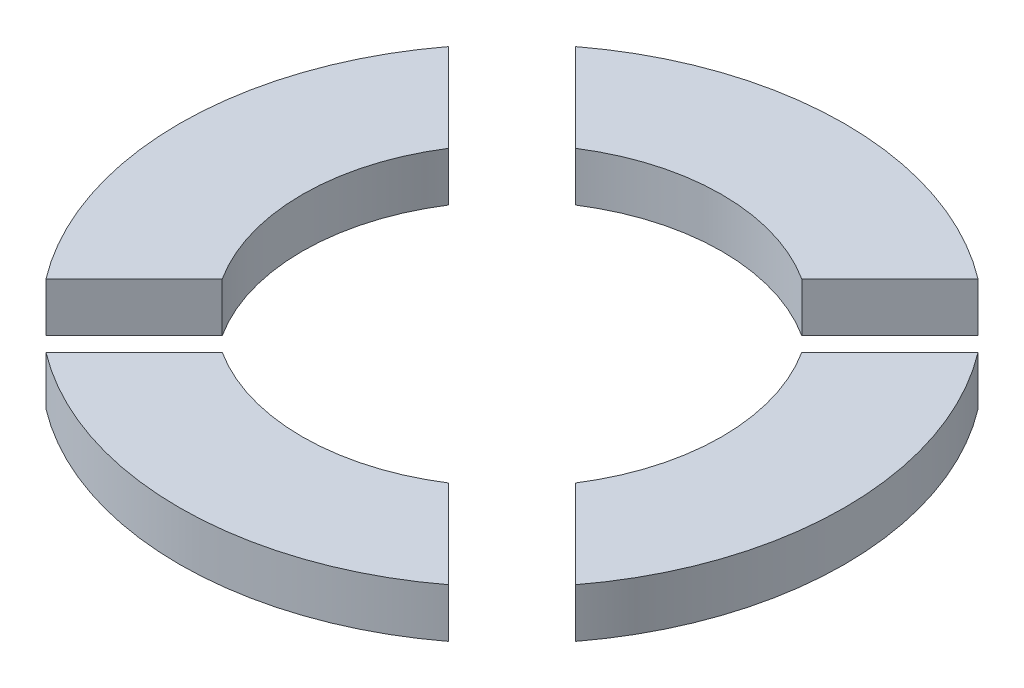
ISO-10303-21;
HEADER;
FILE_DESCRIPTION(('STEP AP214'),'2;1');
FILE_NAME('part.step','',(''),(''),'','','');
FILE_SCHEMA(('AUTOMOTIVE_DESIGN { 1 0 10303 214 1 1 1 1 }'));
ENDSEC;
DATA;
#1=APPLICATION_CONTEXT('core data for automotive mechanical design processes');
#2=APPLICATION_PROTOCOL_DEFINITION('international standard','automotive_design',2000,#1);
#3=PRODUCT_CONTEXT('',#1,'mechanical');
#4=PRODUCT('Part','Part','',(#3));
#5=PRODUCT_RELATED_PRODUCT_CATEGORY('part','',(#4));
#6=PRODUCT_DEFINITION_FORMATION('','',#4);
#7=PRODUCT_DEFINITION_CONTEXT('part definition',#1,'design');
#8=PRODUCT_DEFINITION('design','',#6,#7);
#9=PRODUCT_DEFINITION_SHAPE('','',#8);
#10=(LENGTH_UNIT() NAMED_UNIT(*) SI_UNIT(.MILLI.,.METRE.));
#11=(NAMED_UNIT(*) PLANE_ANGLE_UNIT() SI_UNIT($,.RADIAN.));
#12=(NAMED_UNIT(*) SI_UNIT($,.STERADIAN.) SOLID_ANGLE_UNIT());
#13=UNCERTAINTY_MEASURE_WITH_UNIT(LENGTH_MEASURE(1.E-05),#10,'distance_accuracy_value','');
#14=(GEOMETRIC_REPRESENTATION_CONTEXT(3) GLOBAL_UNCERTAINTY_ASSIGNED_CONTEXT((#13)) GLOBAL_UNIT_ASSIGNED_CONTEXT((#10,
#11,#12)) REPRESENTATION_CONTEXT('',''));
#15=CARTESIAN_POINT('',(0.,0.,0.));
#16=DIRECTION('',(0.,0.,1.));
#17=DIRECTION('',(1.,0.,0.));
#18=AXIS2_PLACEMENT_3D('',#15,#16,#17);
#19=CARTESIAN_POINT('',(0.,0.12,0.));
#20=DIRECTION('',(0.,-1.,0.));
#21=DIRECTION('',(0.,0.,-1.));
#22=AXIS2_PLACEMENT_3D('',#19,#20,#21);
#23=CYLINDRICAL_SURFACE('',#22,0.8125);
#24=CARTESIAN_POINT('',(0.,0.,0.));
#25=DIRECTION('',(0.,1.,0.));
#26=DIRECTION('',(0.,0.,1.));
#27=AXIS2_PLACEMENT_3D('',#24,#25,#26);
#28=CIRCLE('',#27,0.8125);
#29=CARTESIAN_POINT('',(-0.647016429518933,0.,-0.491452937657891));
#30=VERTEX_POINT('',#29);
#31=CARTESIAN_POINT('',(-0.647016429518933,0.,0.491452937657891));
#32=VERTEX_POINT('',#31);
#33=EDGE_CURVE('E113',#30,#32,#28,.T.);
#34=ORIENTED_EDGE('',*,*,#33,.T.);
#35=DIRECTION('',(0.,-1.,0.));
#36=VECTOR('',#35,1.);
#37=CARTESIAN_POINT('',(-0.647016429518933,0.12,0.491452937657891));
#38=LINE('',#37,#36);
#39=CARTESIAN_POINT('',(-0.647016429518933,0.12,0.491452937657891));
#40=VERTEX_POINT('',#39);
#41=EDGE_CURVE('E12',#40,#32,#38,.T.);
#42=ORIENTED_EDGE('',*,*,#41,.F.);
#43=CARTESIAN_POINT('',(0.,0.12,0.));
#44=DIRECTION('',(0.,1.,0.));
#45=DIRECTION('',(0.,0.,1.));
#46=AXIS2_PLACEMENT_3D('',#43,#44,#45);
#47=CIRCLE('',#46,0.8125);
#48=CARTESIAN_POINT('',(-0.647016429518933,0.12,-0.491452937657891));
#49=VERTEX_POINT('',#48);
#50=EDGE_CURVE('E101',#49,#40,#47,.T.);
#51=ORIENTED_EDGE('',*,*,#50,.F.);
#52=DIRECTION('',(0.,-1.,0.));
#53=VECTOR('',#52,1.);
#54=CARTESIAN_POINT('',(-0.647016429518933,0.12,-0.491452937657891));
#55=LINE('',#54,#53);
#56=EDGE_CURVE('E109',#49,#30,#55,.T.);
#57=ORIENTED_EDGE('',*,*,#56,.T.);
#58=EDGE_LOOP('',(#34,#42,#51,#57));
#59=FACE_BOUND('',#58,.T.);
#60=ADVANCED_FACE('F50',(#59),#23,.T.);
#61=CARTESIAN_POINT('',(-0.431728246125112,0.12,0.276164754264072));
#62=DIRECTION('',(-0.707106781186544,0.,-0.707106781186551));
#63=DIRECTION('',(-0.707106781186551,0.,0.707106781186544));
#64=AXIS2_PLACEMENT_3D('',#61,#62,#63);
#65=PLANE('',#64);
#66=DIRECTION('',(0.707106781186551,0.,-0.707106781186544));
#67=VECTOR('',#66,1.);
#68=CARTESIAN_POINT('',(-0.431728246125112,0.,0.276164754264072));
#69=LINE('',#68,#67);
#70=CARTESIAN_POINT('',(-0.431728246125112,0.,0.276164754264072));
#71=VERTEX_POINT('',#70);
#72=EDGE_CURVE('E105',#32,#71,#69,.T.);
#73=ORIENTED_EDGE('',*,*,#72,.T.);
#74=DIRECTION('',(0.,-1.,0.));
#75=VECTOR('',#74,1.);
#76=CARTESIAN_POINT('',(-0.431728246125112,0.12,0.276164754264072));
#77=LINE('',#76,#75);
#78=CARTESIAN_POINT('',(-0.431728246125112,0.12,0.276164754264072));
#79=VERTEX_POINT('',#78);
#80=EDGE_CURVE('E58',#79,#71,#77,.T.);
#81=ORIENTED_EDGE('',*,*,#80,.F.);
#82=DIRECTION('',(0.707106781186551,0.,-0.707106781186544));
#83=VECTOR('',#82,1.);
#84=CARTESIAN_POINT('',(-0.431728246125112,0.12,0.276164754264072));
#85=LINE('',#84,#83);
#86=EDGE_CURVE('E96',#40,#79,#85,.T.);
#87=ORIENTED_EDGE('',*,*,#86,.F.);
#88=ORIENTED_EDGE('',*,*,#41,.T.);
#89=EDGE_LOOP('',(#73,#81,#87,#88));
#90=FACE_BOUND('',#89,.T.);
#91=ADVANCED_FACE('F104',(#90),#65,.F.);
#92=CARTESIAN_POINT('',(0.,0.12,0.));
#93=DIRECTION('',(0.,-1.,0.));
#94=DIRECTION('',(0.,0.,-1.));
#95=AXIS2_PLACEMENT_3D('',#92,#93,#94);
#96=CYLINDRICAL_SURFACE('',#95,0.5125);
#97=CARTESIAN_POINT('',(0.,0.,0.));
#98=DIRECTION('',(0.,-1.,0.));
#99=DIRECTION('',(0.,0.,1.));
#100=AXIS2_PLACEMENT_3D('',#97,#98,#99);
#101=CIRCLE('',#100,0.5125);
#102=CARTESIAN_POINT('',(-0.431728246125112,0.,-0.276164754264072));
#103=VERTEX_POINT('',#102);
#104=EDGE_CURVE('E83',#71,#103,#101,.T.);
#105=ORIENTED_EDGE('',*,*,#104,.T.);
#106=DIRECTION('',(0.,-1.,0.));
#107=VECTOR('',#106,1.);
#108=CARTESIAN_POINT('',(-0.431728246125112,0.12,-0.276164754264072));
#109=LINE('',#108,#107);
#110=CARTESIAN_POINT('',(-0.431728246125112,0.12,-0.276164754264072));
#111=VERTEX_POINT('',#110);
#112=EDGE_CURVE('E106',#111,#103,#109,.T.);
#113=ORIENTED_EDGE('',*,*,#112,.F.);
#114=CARTESIAN_POINT('',(0.,0.12,0.));
#115=DIRECTION('',(0.,-1.,0.));
#116=DIRECTION('',(0.,0.,1.));
#117=AXIS2_PLACEMENT_3D('',#114,#115,#116);
#118=CIRCLE('',#117,0.5125);
#119=EDGE_CURVE('E99',#79,#111,#118,.T.);
#120=ORIENTED_EDGE('',*,*,#119,.F.);
#121=ORIENTED_EDGE('',*,*,#80,.T.);
#122=EDGE_LOOP('',(#105,#113,#120,#121));
#123=FACE_BOUND('',#122,.T.);
#124=ADVANCED_FACE('F107',(#123),#96,.F.);
#125=CARTESIAN_POINT('',(-0.647016429518933,0.12,-0.491452937657891));
#126=DIRECTION('',(-0.707106781186544,0.,0.707106781186551));
#127=DIRECTION('',(0.707106781186551,0.,0.707106781186544));
#128=AXIS2_PLACEMENT_3D('',#125,#126,#127);
#129=PLANE('',#128);
#130=DIRECTION('',(-0.707106781186551,0.,-0.707106781186544));
#131=VECTOR('',#130,1.);
#132=CARTESIAN_POINT('',(-0.647016429518933,0.,-0.491452937657891));
#133=LINE('',#132,#131);
#134=EDGE_CURVE('E89',#103,#30,#133,.T.);
#135=ORIENTED_EDGE('',*,*,#134,.T.);
#136=ORIENTED_EDGE('',*,*,#56,.F.);
#137=DIRECTION('',(-0.707106781186551,0.,-0.707106781186544));
#138=VECTOR('',#137,1.);
#139=CARTESIAN_POINT('',(-0.647016429518933,0.12,-0.491452937657891));
#140=LINE('',#139,#138);
#141=EDGE_CURVE('E66',#111,#49,#140,.T.);
#142=ORIENTED_EDGE('',*,*,#141,.F.);
#143=ORIENTED_EDGE('',*,*,#112,.T.);
#144=EDGE_LOOP('',(#135,#136,#142,#143));
#145=FACE_BOUND('',#144,.T.);
#146=ADVANCED_FACE('F120',(#145),#129,.F.);
#147=CARTESIAN_POINT('',(0.,0.12,0.));
#148=DIRECTION('',(0.,1.,0.));
#149=DIRECTION('',(0.,0.,1.));
#150=AXIS2_PLACEMENT_3D('',#147,#148,#149);
#151=PLANE('',#150);
#152=ORIENTED_EDGE('',*,*,#50,.T.);
#153=ORIENTED_EDGE('',*,*,#86,.T.);
#154=ORIENTED_EDGE('',*,*,#119,.T.);
#155=ORIENTED_EDGE('',*,*,#141,.T.);
#156=EDGE_LOOP('',(#152,#153,#154,#155));
#157=FACE_BOUND('',#156,.T.);
#158=ADVANCED_FACE('F97',(#157),#151,.T.);
#159=CARTESIAN_POINT('',(0.,0.,0.));
#160=DIRECTION('',(0.,1.,0.));
#161=DIRECTION('',(0.,0.,1.));
#162=AXIS2_PLACEMENT_3D('',#159,#160,#161);
#163=PLANE('',#162);
#164=ORIENTED_EDGE('',*,*,#33,.F.);
#165=ORIENTED_EDGE('',*,*,#134,.F.);
#166=ORIENTED_EDGE('',*,*,#104,.F.);
#167=ORIENTED_EDGE('',*,*,#72,.F.);
#168=EDGE_LOOP('',(#164,#165,#166,#167));
#169=FACE_BOUND('',#168,.T.);
#170=ADVANCED_FACE('F123',(#169),#163,.F.);
#171=CLOSED_SHELL('',(#60,#91,#124,#146,#158,#170));
#172=MANIFOLD_SOLID_BREP('B2',#171);
#173=CARTESIAN_POINT('',(0.,0.12,0.));
#174=DIRECTION('',(0.,-1.,0.));
#175=DIRECTION('',(0.,0.,-1.));
#176=AXIS2_PLACEMENT_3D('',#173,#174,#175);
#177=CYLINDRICAL_SURFACE('',#176,0.8125);
#178=CARTESIAN_POINT('',(0.,0.,0.));
#179=DIRECTION('',(0.,1.,0.));
#180=DIRECTION('',(0.,0.,1.));
#181=AXIS2_PLACEMENT_3D('',#178,#179,#180);
#182=CIRCLE('',#181,0.8125);
#183=CARTESIAN_POINT('',(-0.491452937657893,0.,0.647016429518932));
#184=VERTEX_POINT('',#183);
#185=CARTESIAN_POINT('',(0.491452937657893,0.,0.647016429518932));
#186=VERTEX_POINT('',#185);
#187=EDGE_CURVE('E252',#184,#186,#182,.T.);
#188=ORIENTED_EDGE('',*,*,#187,.T.);
#189=DIRECTION('',(0.,-1.,0.));
#190=VECTOR('',#189,1.);
#191=CARTESIAN_POINT('',(0.491452937657893,0.12,0.647016429518932));
#192=LINE('',#191,#190);
#193=CARTESIAN_POINT('',(0.491452937657893,0.12,0.647016429518932));
#194=VERTEX_POINT('',#193);
#195=EDGE_CURVE('E48',#194,#186,#192,.T.);
#196=ORIENTED_EDGE('',*,*,#195,.F.);
#197=CARTESIAN_POINT('',(0.,0.12,0.));
#198=DIRECTION('',(0.,1.,0.));
#199=DIRECTION('',(0.,0.,1.));
#200=AXIS2_PLACEMENT_3D('',#197,#198,#199);
#201=CIRCLE('',#200,0.8125);
#202=CARTESIAN_POINT('',(-0.491452937657893,0.12,0.647016429518932));
#203=VERTEX_POINT('',#202);
#204=EDGE_CURVE('E236',#203,#194,#201,.T.);
#205=ORIENTED_EDGE('',*,*,#204,.F.);
#206=DIRECTION('',(0.,-1.,0.));
#207=VECTOR('',#206,1.);
#208=CARTESIAN_POINT('',(-0.491452937657893,0.12,0.647016429518932));
#209=LINE('',#208,#207);
#210=EDGE_CURVE('E248',#203,#184,#209,.T.);
#211=ORIENTED_EDGE('',*,*,#210,.T.);
#212=EDGE_LOOP('',(#188,#196,#205,#211));
#213=FACE_BOUND('',#212,.T.);
#214=ADVANCED_FACE('F184',(#213),#177,.T.);
#215=CARTESIAN_POINT('',(0.276164754264071,0.12,0.431728246125112));
#216=DIRECTION('',(-0.707106781186543,0.,0.707106781186552));
#217=DIRECTION('',(0.707106781186552,0.,0.707106781186543));
#218=AXIS2_PLACEMENT_3D('',#215,#216,#217);
#219=PLANE('',#218);
#220=DIRECTION('',(-0.707106781186552,0.,-0.707106781186543));
#221=VECTOR('',#220,1.);
#222=CARTESIAN_POINT('',(0.276164754264071,0.,0.431728246125112));
#223=LINE('',#222,#221);
#224=CARTESIAN_POINT('',(0.276164754264071,0.,0.431728246125112));
#225=VERTEX_POINT('',#224);
#226=EDGE_CURVE('E241',#186,#225,#223,.T.);
#227=ORIENTED_EDGE('',*,*,#226,.T.);
#228=DIRECTION('',(0.,-1.,0.));
#229=VECTOR('',#228,1.);
#230=CARTESIAN_POINT('',(0.276164754264071,0.12,0.431728246125112));
#231=LINE('',#230,#229);
#232=CARTESIAN_POINT('',(0.276164754264071,0.12,0.431728246125112));
#233=VERTEX_POINT('',#232);
#234=EDGE_CURVE('E193',#233,#225,#231,.T.);
#235=ORIENTED_EDGE('',*,*,#234,.F.);
#236=DIRECTION('',(-0.707106781186552,0.,-0.707106781186543));
#237=VECTOR('',#236,1.);
#238=CARTESIAN_POINT('',(0.276164754264071,0.12,0.431728246125112));
#239=LINE('',#238,#237);
#240=EDGE_CURVE('E231',#194,#233,#239,.T.);
#241=ORIENTED_EDGE('',*,*,#240,.F.);
#242=ORIENTED_EDGE('',*,*,#195,.T.);
#243=EDGE_LOOP('',(#227,#235,#241,#242));
#244=FACE_BOUND('',#243,.T.);
#245=ADVANCED_FACE('F240',(#244),#219,.F.);
#246=CARTESIAN_POINT('',(0.,0.12,0.));
#247=DIRECTION('',(0.,-1.,0.));
#248=DIRECTION('',(0.,0.,-1.));
#249=AXIS2_PLACEMENT_3D('',#246,#247,#248);
#250=CYLINDRICAL_SURFACE('',#249,0.5125);
#251=CARTESIAN_POINT('',(0.,0.,0.));
#252=DIRECTION('',(0.,-1.,0.));
#253=DIRECTION('',(0.,0.,1.));
#254=AXIS2_PLACEMENT_3D('',#251,#252,#253);
#255=CIRCLE('',#254,0.5125);
#256=CARTESIAN_POINT('',(-0.276164754264071,0.,0.431728246125112));
#257=VERTEX_POINT('',#256);
#258=EDGE_CURVE('E218',#225,#257,#255,.T.);
#259=ORIENTED_EDGE('',*,*,#258,.T.);
#260=DIRECTION('',(0.,-1.,0.));
#261=VECTOR('',#260,1.);
#262=CARTESIAN_POINT('',(-0.276164754264071,0.12,0.431728246125112));
#263=LINE('',#262,#261);
#264=CARTESIAN_POINT('',(-0.276164754264071,0.12,0.431728246125112));
#265=VERTEX_POINT('',#264);
#266=EDGE_CURVE('E243',#265,#257,#263,.T.);
#267=ORIENTED_EDGE('',*,*,#266,.F.);
#268=CARTESIAN_POINT('',(0.,0.12,0.));
#269=DIRECTION('',(0.,-1.,0.));
#270=DIRECTION('',(0.,0.,1.));
#271=AXIS2_PLACEMENT_3D('',#268,#269,#270);
#272=CIRCLE('',#271,0.5125);
#273=EDGE_CURVE('E234',#233,#265,#272,.T.);
#274=ORIENTED_EDGE('',*,*,#273,.F.);
#275=ORIENTED_EDGE('',*,*,#234,.T.);
#276=EDGE_LOOP('',(#259,#267,#274,#275));
#277=FACE_BOUND('',#276,.T.);
#278=ADVANCED_FACE('F244',(#277),#250,.F.);
#279=CARTESIAN_POINT('',(-0.491452937657893,0.12,0.647016429518932));
#280=DIRECTION('',(0.707106781186543,0.,0.707106781186552));
#281=DIRECTION('',(0.707106781186552,0.,-0.707106781186543));
#282=AXIS2_PLACEMENT_3D('',#279,#280,#281);
#283=PLANE('',#282);
#284=DIRECTION('',(-0.707106781186552,0.,0.707106781186543));
#285=VECTOR('',#284,1.);
#286=CARTESIAN_POINT('',(-0.491452937657893,0.,0.647016429518932));
#287=LINE('',#286,#285);
#288=EDGE_CURVE('E224',#257,#184,#287,.T.);
#289=ORIENTED_EDGE('',*,*,#288,.T.);
#290=ORIENTED_EDGE('',*,*,#210,.F.);
#291=DIRECTION('',(-0.707106781186552,0.,0.707106781186543));
#292=VECTOR('',#291,1.);
#293=CARTESIAN_POINT('',(-0.491452937657893,0.12,0.647016429518932));
#294=LINE('',#293,#292);
#295=EDGE_CURVE('E201',#265,#203,#294,.T.);
#296=ORIENTED_EDGE('',*,*,#295,.F.);
#297=ORIENTED_EDGE('',*,*,#266,.T.);
#298=EDGE_LOOP('',(#289,#290,#296,#297));
#299=FACE_BOUND('',#298,.T.);
#300=ADVANCED_FACE('F265',(#299),#283,.F.);
#301=CARTESIAN_POINT('',(0.,0.12,0.));
#302=DIRECTION('',(0.,1.,0.));
#303=DIRECTION('',(0.,0.,1.));
#304=AXIS2_PLACEMENT_3D('',#301,#302,#303);
#305=PLANE('',#304);
#306=ORIENTED_EDGE('',*,*,#204,.T.);
#307=ORIENTED_EDGE('',*,*,#240,.T.);
#308=ORIENTED_EDGE('',*,*,#273,.T.);
#309=ORIENTED_EDGE('',*,*,#295,.T.);
#310=EDGE_LOOP('',(#306,#307,#308,#309));
#311=FACE_BOUND('',#310,.T.);
#312=ADVANCED_FACE('F232',(#311),#305,.T.);
#313=CARTESIAN_POINT('',(0.,0.,0.));
#314=DIRECTION('',(0.,1.,0.));
#315=DIRECTION('',(0.,0.,1.));
#316=AXIS2_PLACEMENT_3D('',#313,#314,#315);
#317=PLANE('',#316);
#318=ORIENTED_EDGE('',*,*,#187,.F.);
#319=ORIENTED_EDGE('',*,*,#288,.F.);
#320=ORIENTED_EDGE('',*,*,#258,.F.);
#321=ORIENTED_EDGE('',*,*,#226,.F.);
#322=EDGE_LOOP('',(#318,#319,#320,#321));
#323=FACE_BOUND('',#322,.T.);
#324=ADVANCED_FACE('F268',(#323),#317,.F.);
#325=CLOSED_SHELL('',(#214,#245,#278,#300,#312,#324));
#326=MANIFOLD_SOLID_BREP('B6',#325);
#327=CARTESIAN_POINT('',(0.,0.12,0.));
#328=DIRECTION('',(0.,-1.,0.));
#329=DIRECTION('',(0.,0.,-1.));
#330=AXIS2_PLACEMENT_3D('',#327,#328,#329);
#331=CYLINDRICAL_SURFACE('',#330,0.5125);
#332=CARTESIAN_POINT('',(0.,0.,0.));
#333=DIRECTION('',(0.,-1.,0.));
#334=DIRECTION('',(0.,0.,1.));
#335=AXIS2_PLACEMENT_3D('',#332,#333,#334);
#336=CIRCLE('',#335,0.5125);
#337=CARTESIAN_POINT('',(-0.276164754264071,0.,-0.431728246125112));
#338=VERTEX_POINT('',#337);
#339=CARTESIAN_POINT('',(0.276164754264071,0.,-0.431728246125112));
#340=VERTEX_POINT('',#339);
#341=EDGE_CURVE('E392',#338,#340,#336,.T.);
#342=ORIENTED_EDGE('',*,*,#341,.T.);
#343=DIRECTION('',(0.,-1.,0.));
#344=VECTOR('',#343,1.);
#345=CARTESIAN_POINT('',(0.276164754264071,0.12,-0.431728246125112));
#346=LINE('',#345,#344);
#347=CARTESIAN_POINT('',(0.276164754264071,0.12,-0.431728246125112));
#348=VERTEX_POINT('',#347);
#349=EDGE_CURVE('E182',#348,#340,#346,.T.);
#350=ORIENTED_EDGE('',*,*,#349,.F.);
#351=CARTESIAN_POINT('',(0.,0.12,0.));
#352=DIRECTION('',(0.,-1.,0.));
#353=DIRECTION('',(0.,0.,1.));
#354=AXIS2_PLACEMENT_3D('',#351,#352,#353);
#355=CIRCLE('',#354,0.5125);
#356=CARTESIAN_POINT('',(-0.276164754264071,0.12,-0.431728246125112));
#357=VERTEX_POINT('',#356);
#358=EDGE_CURVE('E380',#357,#348,#355,.T.);
#359=ORIENTED_EDGE('',*,*,#358,.F.);
#360=DIRECTION('',(0.,-1.,0.));
#361=VECTOR('',#360,1.);
#362=CARTESIAN_POINT('',(-0.276164754264071,0.12,-0.431728246125112));
#363=LINE('',#362,#361);
#364=EDGE_CURVE('E388',#357,#338,#363,.T.);
#365=ORIENTED_EDGE('',*,*,#364,.T.);
#366=EDGE_LOOP('',(#342,#350,#359,#365));
#367=FACE_BOUND('',#366,.T.);
#368=ADVANCED_FACE('F329',(#367),#331,.F.);
#369=CARTESIAN_POINT('',(0.491452937657893,0.12,-0.647016429518932));
#370=DIRECTION('',(-0.707106781186543,0.,-0.707106781186552));
#371=DIRECTION('',(-0.707106781186552,0.,0.707106781186543));
#372=AXIS2_PLACEMENT_3D('',#369,#370,#371);
#373=PLANE('',#372);
#374=DIRECTION('',(0.707106781186552,0.,-0.707106781186543));
#375=VECTOR('',#374,1.);
#376=CARTESIAN_POINT('',(0.491452937657893,0.,-0.647016429518932));
#377=LINE('',#376,#375);
#378=CARTESIAN_POINT('',(0.491452937657893,0.,-0.647016429518932));
#379=VERTEX_POINT('',#378);
#380=EDGE_CURVE('E384',#340,#379,#377,.T.);
#381=ORIENTED_EDGE('',*,*,#380,.T.);
#382=DIRECTION('',(0.,-1.,0.));
#383=VECTOR('',#382,1.);
#384=CARTESIAN_POINT('',(0.491452937657893,0.12,-0.647016429518932));
#385=LINE('',#384,#383);
#386=CARTESIAN_POINT('',(0.491452937657893,0.12,-0.647016429518932));
#387=VERTEX_POINT('',#386);
#388=EDGE_CURVE('E337',#387,#379,#385,.T.);
#389=ORIENTED_EDGE('',*,*,#388,.F.);
#390=DIRECTION('',(0.707106781186552,0.,-0.707106781186543));
#391=VECTOR('',#390,1.);
#392=CARTESIAN_POINT('',(0.491452937657893,0.12,-0.647016429518932));
#393=LINE('',#392,#391);
#394=EDGE_CURVE('E375',#348,#387,#393,.T.);
#395=ORIENTED_EDGE('',*,*,#394,.F.);
#396=ORIENTED_EDGE('',*,*,#349,.T.);
#397=EDGE_LOOP('',(#381,#389,#395,#396));
#398=FACE_BOUND('',#397,.T.);
#399=ADVANCED_FACE('F383',(#398),#373,.F.);
#400=CARTESIAN_POINT('',(0.,0.12,0.));
#401=DIRECTION('',(0.,-1.,0.));
#402=DIRECTION('',(0.,0.,-1.));
#403=AXIS2_PLACEMENT_3D('',#400,#401,#402);
#404=CYLINDRICAL_SURFACE('',#403,0.8125);
#405=CARTESIAN_POINT('',(0.,0.,0.));
#406=DIRECTION('',(0.,1.,0.));
#407=DIRECTION('',(0.,0.,1.));
#408=AXIS2_PLACEMENT_3D('',#405,#406,#407);
#409=CIRCLE('',#408,0.8125);
#410=CARTESIAN_POINT('',(-0.491452937657893,0.,-0.647016429518932));
#411=VERTEX_POINT('',#410);
#412=EDGE_CURVE('E362',#379,#411,#409,.T.);
#413=ORIENTED_EDGE('',*,*,#412,.T.);
#414=DIRECTION('',(0.,-1.,0.));
#415=VECTOR('',#414,1.);
#416=CARTESIAN_POINT('',(-0.491452937657893,0.12,-0.647016429518932));
#417=LINE('',#416,#415);
#418=CARTESIAN_POINT('',(-0.491452937657893,0.12,-0.647016429518932));
#419=VERTEX_POINT('',#418);
#420=EDGE_CURVE('E385',#419,#411,#417,.T.);
#421=ORIENTED_EDGE('',*,*,#420,.F.);
#422=CARTESIAN_POINT('',(0.,0.12,0.));
#423=DIRECTION('',(0.,1.,0.));
#424=DIRECTION('',(0.,0.,1.));
#425=AXIS2_PLACEMENT_3D('',#422,#423,#424);
#426=CIRCLE('',#425,0.8125);
#427=EDGE_CURVE('E378',#387,#419,#426,.T.);
#428=ORIENTED_EDGE('',*,*,#427,.F.);
#429=ORIENTED_EDGE('',*,*,#388,.T.);
#430=EDGE_LOOP('',(#413,#421,#428,#429));
#431=FACE_BOUND('',#430,.T.);
#432=ADVANCED_FACE('F386',(#431),#404,.T.);
#433=CARTESIAN_POINT('',(-0.491452937657893,0.12,-0.647016429518932));
#434=DIRECTION('',(0.707106781186544,0.,-0.707106781186551));
#435=DIRECTION('',(-0.707106781186551,0.,-0.707106781186544));
#436=AXIS2_PLACEMENT_3D('',#433,#434,#435);
#437=PLANE('',#436);
#438=DIRECTION('',(0.707106781186551,0.,0.707106781186544));
#439=VECTOR('',#438,1.);
#440=CARTESIAN_POINT('',(-0.491452937657893,0.,-0.647016429518932));
#441=LINE('',#440,#439);
#442=EDGE_CURVE('E368',#411,#338,#441,.T.);
#443=ORIENTED_EDGE('',*,*,#442,.T.);
#444=ORIENTED_EDGE('',*,*,#364,.F.);
#445=DIRECTION('',(0.707106781186551,0.,0.707106781186544));
#446=VECTOR('',#445,1.);
#447=CARTESIAN_POINT('',(-0.491452937657893,0.12,-0.647016429518932));
#448=LINE('',#447,#446);
#449=EDGE_CURVE('E345',#419,#357,#448,.T.);
#450=ORIENTED_EDGE('',*,*,#449,.F.);
#451=ORIENTED_EDGE('',*,*,#420,.T.);
#452=EDGE_LOOP('',(#443,#444,#450,#451));
#453=FACE_BOUND('',#452,.T.);
#454=ADVANCED_FACE('F399',(#453),#437,.F.);
#455=CARTESIAN_POINT('',(0.,0.12,0.));
#456=DIRECTION('',(0.,1.,0.));
#457=DIRECTION('',(0.,0.,1.));
#458=AXIS2_PLACEMENT_3D('',#455,#456,#457);
#459=PLANE('',#458);
#460=ORIENTED_EDGE('',*,*,#358,.T.);
#461=ORIENTED_EDGE('',*,*,#394,.T.);
#462=ORIENTED_EDGE('',*,*,#427,.T.);
#463=ORIENTED_EDGE('',*,*,#449,.T.);
#464=EDGE_LOOP('',(#460,#461,#462,#463));
#465=FACE_BOUND('',#464,.T.);
#466=ADVANCED_FACE('F376',(#465),#459,.T.);
#467=CARTESIAN_POINT('',(0.,0.,0.));
#468=DIRECTION('',(0.,1.,0.));
#469=DIRECTION('',(0.,0.,1.));
#470=AXIS2_PLACEMENT_3D('',#467,#468,#469);
#471=PLANE('',#470);
#472=ORIENTED_EDGE('',*,*,#341,.F.);
#473=ORIENTED_EDGE('',*,*,#442,.F.);
#474=ORIENTED_EDGE('',*,*,#412,.F.);
#475=ORIENTED_EDGE('',*,*,#380,.F.);
#476=EDGE_LOOP('',(#472,#473,#474,#475));
#477=FACE_BOUND('',#476,.T.);
#478=ADVANCED_FACE('F402',(#477),#471,.F.);
#479=CLOSED_SHELL('',(#368,#399,#432,#454,#466,#478));
#480=MANIFOLD_SOLID_BREP('B42',#479);
#481=CARTESIAN_POINT('',(0.,0.12,0.));
#482=DIRECTION('',(0.,-1.,0.));
#483=DIRECTION('',(0.,0.,-1.));
#484=AXIS2_PLACEMENT_3D('',#481,#482,#483);
#485=CYLINDRICAL_SURFACE('',#484,0.5125);
#486=CARTESIAN_POINT('',(0.,0.,0.));
#487=DIRECTION('',(0.,-1.,0.));
#488=DIRECTION('',(0.,0.,1.));
#489=AXIS2_PLACEMENT_3D('',#486,#487,#488);
#490=CIRCLE('',#489,0.5125);
#491=CARTESIAN_POINT('',(0.431728246125111,0.,-0.276164754264072));
#492=VERTEX_POINT('',#491);
#493=CARTESIAN_POINT('',(0.431728246125112,0.,0.276164754264071));
#494=VERTEX_POINT('',#493);
#495=EDGE_CURVE('E516',#492,#494,#490,.T.);
#496=ORIENTED_EDGE('',*,*,#495,.T.);
#497=DIRECTION('',(0.,-1.,0.));
#498=VECTOR('',#497,1.);
#499=CARTESIAN_POINT('',(0.431728246125112,0.12,0.276164754264071));
#500=LINE('',#499,#498);
#501=CARTESIAN_POINT('',(0.431728246125112,0.12,0.276164754264071));
#502=VERTEX_POINT('',#501);
#503=EDGE_CURVE('E327',#502,#494,#500,.T.);
#504=ORIENTED_EDGE('',*,*,#503,.F.);
#505=CARTESIAN_POINT('',(0.,0.12,0.));
#506=DIRECTION('',(0.,-1.,0.));
#507=DIRECTION('',(0.,0.,1.));
#508=AXIS2_PLACEMENT_3D('',#505,#506,#507);
#509=CIRCLE('',#508,0.5125);
#510=CARTESIAN_POINT('',(0.431728246125111,0.12,-0.276164754264072));
#511=VERTEX_POINT('',#510);
#512=EDGE_CURVE('E504',#511,#502,#509,.T.);
#513=ORIENTED_EDGE('',*,*,#512,.F.);
#514=DIRECTION('',(0.,-1.,0.));
#515=VECTOR('',#514,1.);
#516=CARTESIAN_POINT('',(0.431728246125111,0.12,-0.276164754264072));
#517=LINE('',#516,#515);
#518=EDGE_CURVE('E512',#511,#492,#517,.T.);
#519=ORIENTED_EDGE('',*,*,#518,.T.);
#520=EDGE_LOOP('',(#496,#504,#513,#519));
#521=FACE_BOUND('',#520,.T.);
#522=ADVANCED_FACE('F453',(#521),#485,.F.);
#523=CARTESIAN_POINT('',(0.431728246125112,0.12,0.276164754264071));
#524=DIRECTION('',(0.707106781186543,0.,-0.707106781186552));
#525=DIRECTION('',(-0.707106781186552,0.,-0.707106781186543));
#526=AXIS2_PLACEMENT_3D('',#523,#524,#525);
#527=PLANE('',#526);
#528=DIRECTION('',(0.707106781186552,0.,0.707106781186543));
#529=VECTOR('',#528,1.);
#530=CARTESIAN_POINT('',(0.431728246125112,0.,0.276164754264071));
#531=LINE('',#530,#529);
#532=CARTESIAN_POINT('',(0.647016429518934,0.,0.491452937657891));
#533=VERTEX_POINT('',#532);
#534=EDGE_CURVE('E508',#494,#533,#531,.T.);
#535=ORIENTED_EDGE('',*,*,#534,.T.);
#536=DIRECTION('',(0.,-1.,0.));
#537=VECTOR('',#536,1.);
#538=CARTESIAN_POINT('',(0.647016429518934,0.12,0.491452937657891));
#539=LINE('',#538,#537);
#540=CARTESIAN_POINT('',(0.647016429518934,0.12,0.491452937657891));
#541=VERTEX_POINT('',#540);
#542=EDGE_CURVE('E461',#541,#533,#539,.T.);
#543=ORIENTED_EDGE('',*,*,#542,.F.);
#544=DIRECTION('',(0.707106781186552,0.,0.707106781186543));
#545=VECTOR('',#544,1.);
#546=CARTESIAN_POINT('',(0.431728246125112,0.12,0.276164754264071));
#547=LINE('',#546,#545);
#548=EDGE_CURVE('E499',#502,#541,#547,.T.);
#549=ORIENTED_EDGE('',*,*,#548,.F.);
#550=ORIENTED_EDGE('',*,*,#503,.T.);
#551=EDGE_LOOP('',(#535,#543,#549,#550));
#552=FACE_BOUND('',#551,.T.);
#553=ADVANCED_FACE('F507',(#552),#527,.F.);
#554=CARTESIAN_POINT('',(0.,0.12,0.));
#555=DIRECTION('',(0.,-1.,0.));
#556=DIRECTION('',(0.,0.,-1.));
#557=AXIS2_PLACEMENT_3D('',#554,#555,#556);
#558=CYLINDRICAL_SURFACE('',#557,0.8125);
#559=CARTESIAN_POINT('',(0.,0.,0.));
#560=DIRECTION('',(0.,1.,0.));
#561=DIRECTION('',(0.,0.,1.));
#562=AXIS2_PLACEMENT_3D('',#559,#560,#561);
#563=CIRCLE('',#562,0.8125);
#564=CARTESIAN_POINT('',(0.647016429518934,0.,-0.491452937657891));
#565=VERTEX_POINT('',#564);
#566=EDGE_CURVE('E486',#533,#565,#563,.T.);
#567=ORIENTED_EDGE('',*,*,#566,.T.);
#568=DIRECTION('',(0.,-1.,0.));
#569=VECTOR('',#568,1.);
#570=CARTESIAN_POINT('',(0.647016429518934,0.12,-0.491452937657891));
#571=LINE('',#570,#569);
#572=CARTESIAN_POINT('',(0.647016429518934,0.12,-0.491452937657891));
#573=VERTEX_POINT('',#572);
#574=EDGE_CURVE('E509',#573,#565,#571,.T.);
#575=ORIENTED_EDGE('',*,*,#574,.F.);
#576=CARTESIAN_POINT('',(0.,0.12,0.));
#577=DIRECTION('',(0.,1.,0.));
#578=DIRECTION('',(0.,0.,1.));
#579=AXIS2_PLACEMENT_3D('',#576,#577,#578);
#580=CIRCLE('',#579,0.8125);
#581=EDGE_CURVE('E502',#541,#573,#580,.T.);
#582=ORIENTED_EDGE('',*,*,#581,.F.);
#583=ORIENTED_EDGE('',*,*,#542,.T.);
#584=EDGE_LOOP('',(#567,#575,#582,#583));
#585=FACE_BOUND('',#584,.T.);
#586=ADVANCED_FACE('F510',(#585),#558,.T.);
#587=CARTESIAN_POINT('',(0.431728246125111,0.12,-0.276164754264072));
#588=DIRECTION('',(0.707106781186543,0.,0.707106781186553));
#589=DIRECTION('',(0.707106781186553,0.,-0.707106781186543));
#590=AXIS2_PLACEMENT_3D('',#587,#588,#589);
#591=PLANE('',#590);
#592=DIRECTION('',(-0.707106781186552,0.,0.707106781186543));
#593=VECTOR('',#592,1.);
#594=CARTESIAN_POINT('',(0.431728246125111,0.,-0.276164754264072));
#595=LINE('',#594,#593);
#596=EDGE_CURVE('E492',#565,#492,#595,.T.);
#597=ORIENTED_EDGE('',*,*,#596,.T.);
#598=ORIENTED_EDGE('',*,*,#518,.F.);
#599=DIRECTION('',(-0.707106781186552,0.,0.707106781186543));
#600=VECTOR('',#599,1.);
#601=CARTESIAN_POINT('',(0.431728246125111,0.12,-0.276164754264072));
#602=LINE('',#601,#600);
#603=EDGE_CURVE('E469',#573,#511,#602,.T.);
#604=ORIENTED_EDGE('',*,*,#603,.F.);
#605=ORIENTED_EDGE('',*,*,#574,.T.);
#606=EDGE_LOOP('',(#597,#598,#604,#605));
#607=FACE_BOUND('',#606,.T.);
#608=ADVANCED_FACE('F523',(#607),#591,.F.);
#609=CARTESIAN_POINT('',(0.,0.12,0.));
#610=DIRECTION('',(0.,1.,0.));
#611=DIRECTION('',(0.,0.,1.));
#612=AXIS2_PLACEMENT_3D('',#609,#610,#611);
#613=PLANE('',#612);
#614=ORIENTED_EDGE('',*,*,#512,.T.);
#615=ORIENTED_EDGE('',*,*,#548,.T.);
#616=ORIENTED_EDGE('',*,*,#581,.T.);
#617=ORIENTED_EDGE('',*,*,#603,.T.);
#618=EDGE_LOOP('',(#614,#615,#616,#617));
#619=FACE_BOUND('',#618,.T.);
#620=ADVANCED_FACE('F500',(#619),#613,.T.);
#621=CARTESIAN_POINT('',(0.,0.,0.));
#622=DIRECTION('',(0.,1.,0.));
#623=DIRECTION('',(0.,0.,1.));
#624=AXIS2_PLACEMENT_3D('',#621,#622,#623);
#625=PLANE('',#624);
#626=ORIENTED_EDGE('',*,*,#495,.F.);
#627=ORIENTED_EDGE('',*,*,#596,.F.);
#628=ORIENTED_EDGE('',*,*,#566,.F.);
#629=ORIENTED_EDGE('',*,*,#534,.F.);
#630=EDGE_LOOP('',(#626,#627,#628,#629));
#631=FACE_BOUND('',#630,.T.);
#632=ADVANCED_FACE('F526',(#631),#625,.F.);
#633=CLOSED_SHELL('',(#522,#553,#586,#608,#620,#632));
#634=MANIFOLD_SOLID_BREP('B176',#633);
#635=ADVANCED_BREP_SHAPE_REPRESENTATION('',(#18,#172,#326,#480,#634),#14);
#636=SHAPE_DEFINITION_REPRESENTATION(#9,#635);
ENDSEC;
END-ISO-10303-21;
